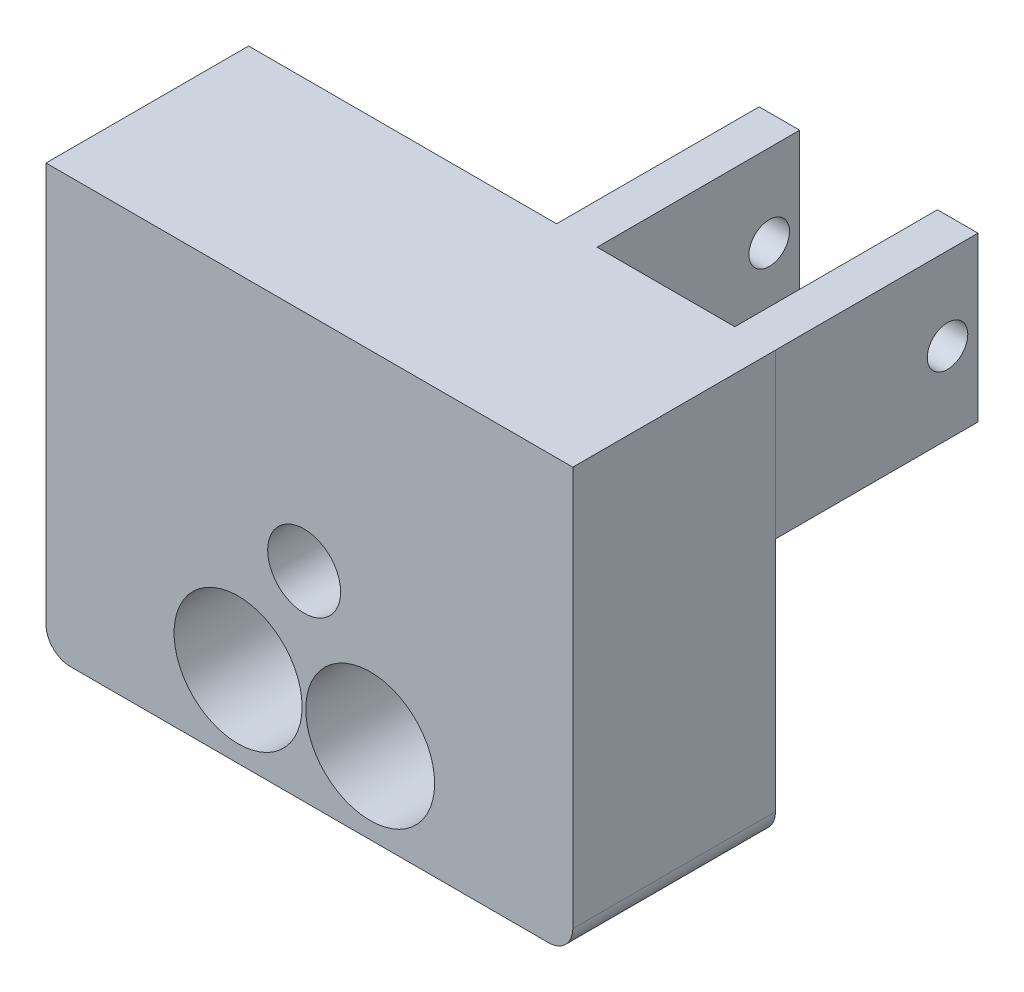
ISO-10303-21;
HEADER;
FILE_DESCRIPTION(('STEP AP214'),'2;1');
FILE_NAME('part.step','',(''),(''),'','','');
FILE_SCHEMA(('AUTOMOTIVE_DESIGN { 1 0 10303 214 1 1 1 1 }'));
ENDSEC;
DATA;
#1=APPLICATION_CONTEXT('core data for automotive mechanical design processes');
#2=APPLICATION_PROTOCOL_DEFINITION('international standard','automotive_design',2000,#1);
#3=PRODUCT_CONTEXT('',#1,'mechanical');
#4=PRODUCT('Part','Part','',(#3));
#5=PRODUCT_RELATED_PRODUCT_CATEGORY('part','',(#4));
#6=PRODUCT_DEFINITION_FORMATION('','',#4);
#7=PRODUCT_DEFINITION_CONTEXT('part definition',#1,'design');
#8=PRODUCT_DEFINITION('design','',#6,#7);
#9=PRODUCT_DEFINITION_SHAPE('','',#8);
#10=(LENGTH_UNIT() NAMED_UNIT(*) SI_UNIT(.MILLI.,.METRE.));
#11=(NAMED_UNIT(*) PLANE_ANGLE_UNIT() SI_UNIT($,.RADIAN.));
#12=(NAMED_UNIT(*) SI_UNIT($,.STERADIAN.) SOLID_ANGLE_UNIT());
#13=UNCERTAINTY_MEASURE_WITH_UNIT(LENGTH_MEASURE(1.E-05),#10,'distance_accuracy_value','');
#14=(GEOMETRIC_REPRESENTATION_CONTEXT(3) GLOBAL_UNCERTAINTY_ASSIGNED_CONTEXT((#13)) GLOBAL_UNIT_ASSIGNED_CONTEXT((#10,
#11,#12)) REPRESENTATION_CONTEXT('',''));
#15=CARTESIAN_POINT('',(0.,0.,0.));
#16=DIRECTION('',(0.,0.,1.));
#17=DIRECTION('',(1.,0.,0.));
#18=AXIS2_PLACEMENT_3D('',#15,#16,#17);
#19=CARTESIAN_POINT('',(71.85,24.6335231574628,25.));
#20=DIRECTION('',(0.,0.,-1.));
#21=DIRECTION('',(-1.,0.,0.));
#22=AXIS2_PLACEMENT_3D('',#19,#20,#21);
#23=CYLINDRICAL_SURFACE('',#22,4.5);
#24=CARTESIAN_POINT('',(71.85,24.6335231574628,25.));
#25=DIRECTION('',(0.,0.,1.));
#26=DIRECTION('',(1.,0.,0.));
#27=AXIS2_PLACEMENT_3D('',#24,#25,#26);
#28=CIRCLE('',#27,4.5);
#29=CARTESIAN_POINT('',(76.35,24.6335231574628,25.));
#30=VERTEX_POINT('',#29);
#31=EDGE_CURVE('E329',#30,#30,#28,.T.);
#32=ORIENTED_EDGE('',*,*,#31,.T.);
#33=EDGE_LOOP('',(#32));
#34=FACE_BOUND('',#33,.T.);
#35=CARTESIAN_POINT('',(71.85,24.6335231574628,7.5));
#36=DIRECTION('',(0.,0.,-1.));
#37=DIRECTION('',(-1.,0.,0.));
#38=AXIS2_PLACEMENT_3D('',#35,#36,#37);
#39=CIRCLE('',#38,4.5);
#40=CARTESIAN_POINT('',(67.35,24.6335231574628,7.5));
#41=VERTEX_POINT('',#40);
#42=EDGE_CURVE('E228',#41,#41,#39,.T.);
#43=ORIENTED_EDGE('',*,*,#42,.T.);
#44=EDGE_LOOP('',(#43));
#45=FACE_BOUND('',#44,.T.);
#46=ADVANCED_FACE('F35',(#34,#45),#23,.F.);
#47=CARTESIAN_POINT('',(0.,0.,25.));
#48=DIRECTION('',(0.,0.,-1.));
#49=DIRECTION('',(-1.,0.,0.));
#50=AXIS2_PLACEMENT_3D('',#47,#48,#49);
#51=PLANE('',#50);
#52=CARTESIAN_POINT('',(80.,10.,25.));
#53=DIRECTION('',(0.,0.,1.));
#54=DIRECTION('',(1.,0.,0.));
#55=AXIS2_PLACEMENT_3D('',#52,#53,#54);
#56=CIRCLE('',#55,7.95);
#57=CARTESIAN_POINT('',(87.95,10.,25.));
#58=VERTEX_POINT('',#57);
#59=EDGE_CURVE('E332',#58,#58,#56,.T.);
#60=ORIENTED_EDGE('',*,*,#59,.F.);
#61=EDGE_LOOP('',(#60));
#62=FACE_BOUND('',#61,.T.);
#63=ORIENTED_EDGE('',*,*,#31,.F.);
#64=EDGE_LOOP('',(#63));
#65=FACE_BOUND('',#64,.T.);
#66=CARTESIAN_POINT('',(63.7,10.,25.));
#67=DIRECTION('',(0.,0.,1.));
#68=DIRECTION('',(1.,0.,0.));
#69=AXIS2_PLACEMENT_3D('',#66,#67,#68);
#70=CIRCLE('',#69,7.9);
#71=CARTESIAN_POINT('',(71.6,10.,25.));
#72=VERTEX_POINT('',#71);
#73=EDGE_CURVE('E205',#72,#72,#70,.T.);
#74=ORIENTED_EDGE('',*,*,#73,.F.);
#75=EDGE_LOOP('',(#74));
#76=FACE_BOUND('',#75,.T.);
#77=DIRECTION('',(0.,1.,0.));
#78=VECTOR('',#77,1.);
#79=CARTESIAN_POINT('',(105.,0.,25.));
#80=LINE('',#79,#78);
#81=CARTESIAN_POINT('',(105.,3.,25.));
#82=VERTEX_POINT('',#81);
#83=CARTESIAN_POINT('',(105.,52.3118668700041,25.));
#84=VERTEX_POINT('',#83);
#85=EDGE_CURVE('E202',#82,#84,#80,.T.);
#86=ORIENTED_EDGE('',*,*,#85,.T.);
#87=DIRECTION('',(-1.,0.,0.));
#88=VECTOR('',#87,1.);
#89=CARTESIAN_POINT('',(105.676011247242,52.3118668700041,25.));
#90=LINE('',#89,#88);
#91=CARTESIAN_POINT('',(40.,52.3118668700041,25.));
#92=VERTEX_POINT('',#91);
#93=EDGE_CURVE('E178',#84,#92,#90,.T.);
#94=ORIENTED_EDGE('',*,*,#93,.T.);
#95=DIRECTION('',(0.,1.,0.));
#96=VECTOR('',#95,1.);
#97=CARTESIAN_POINT('',(40.,0.,25.));
#98=LINE('',#97,#96);
#99=CARTESIAN_POINT('',(40.,3.,25.));
#100=VERTEX_POINT('',#99);
#101=EDGE_CURVE('E314',#100,#92,#98,.T.);
#102=ORIENTED_EDGE('',*,*,#101,.F.);
#103=CARTESIAN_POINT('',(43.,3.,25.));
#104=DIRECTION('',(0.,0.,-1.));
#105=DIRECTION('',(-1.,0.,0.));
#106=AXIS2_PLACEMENT_3D('',#103,#104,#105);
#107=CIRCLE('',#106,3.);
#108=CARTESIAN_POINT('',(43.,0.,25.));
#109=VERTEX_POINT('',#108);
#110=EDGE_CURVE('E216',#100,#109,#107,.F.);
#111=ORIENTED_EDGE('',*,*,#110,.T.);
#112=DIRECTION('',(1.,0.,0.));
#113=VECTOR('',#112,1.);
#114=CARTESIAN_POINT('',(0.,0.,25.));
#115=LINE('',#114,#113);
#116=CARTESIAN_POINT('',(102.,0.,25.));
#117=VERTEX_POINT('',#116);
#118=EDGE_CURVE('E198',#109,#117,#115,.T.);
#119=ORIENTED_EDGE('',*,*,#118,.T.);
#120=CARTESIAN_POINT('',(102.,3.,25.));
#121=DIRECTION('',(0.,0.,-1.));
#122=DIRECTION('',(-1.,0.,0.));
#123=AXIS2_PLACEMENT_3D('',#120,#121,#122);
#124=CIRCLE('',#123,3.);
#125=EDGE_CURVE('E214',#117,#82,#124,.F.);
#126=ORIENTED_EDGE('',*,*,#125,.T.);
#127=EDGE_LOOP('',(#86,#94,#102,#111,#119,#126));
#128=FACE_BOUND('',#127,.T.);
#129=ADVANCED_FACE('F345',(#62,#65,#76,#128),#51,.F.);
#130=CARTESIAN_POINT('',(0.,0.,0.));
#131=DIRECTION('',(0.,0.,-1.));
#132=DIRECTION('',(-1.,0.,0.));
#133=AXIS2_PLACEMENT_3D('',#130,#131,#132);
#134=PLANE('',#133);
#135=DIRECTION('',(-1.,0.,0.));
#136=VECTOR('',#135,1.);
#137=CARTESIAN_POINT('',(104.991701760348,52.3118668700041,0.));
#138=LINE('',#137,#136);
#139=CARTESIAN_POINT('',(105.,52.3118668700041,0.));
#140=VERTEX_POINT('',#139);
#141=CARTESIAN_POINT('',(104.991701760348,52.3118668700041,0.));
#142=VERTEX_POINT('',#141);
#143=EDGE_CURVE('E175',#140,#142,#138,.T.);
#144=ORIENTED_EDGE('',*,*,#143,.F.);
#145=DIRECTION('',(0.,1.,0.));
#146=VECTOR('',#145,1.);
#147=CARTESIAN_POINT('',(105.,0.,0.));
#148=LINE('',#147,#146);
#149=CARTESIAN_POINT('',(105.,3.,0.));
#150=VERTEX_POINT('',#149);
#151=EDGE_CURVE('E187',#150,#140,#148,.T.);
#152=ORIENTED_EDGE('',*,*,#151,.F.);
#153=CARTESIAN_POINT('',(102.,3.,0.));
#154=DIRECTION('',(0.,0.,-1.));
#155=DIRECTION('',(-1.,0.,0.));
#156=AXIS2_PLACEMENT_3D('',#153,#154,#155);
#157=CIRCLE('',#156,3.);
#158=CARTESIAN_POINT('',(102.,0.,0.));
#159=VERTEX_POINT('',#158);
#160=EDGE_CURVE('E209',#150,#159,#157,.T.);
#161=ORIENTED_EDGE('',*,*,#160,.T.);
#162=DIRECTION('',(1.,0.,0.));
#163=VECTOR('',#162,1.);
#164=CARTESIAN_POINT('',(0.,0.,0.));
#165=LINE('',#164,#163);
#166=CARTESIAN_POINT('',(43.,0.,0.));
#167=VERTEX_POINT('',#166);
#168=EDGE_CURVE('E199',#167,#159,#165,.T.);
#169=ORIENTED_EDGE('',*,*,#168,.F.);
#170=CARTESIAN_POINT('',(43.,3.,0.));
#171=DIRECTION('',(0.,0.,-1.));
#172=DIRECTION('',(-1.,0.,0.));
#173=AXIS2_PLACEMENT_3D('',#170,#171,#172);
#174=CIRCLE('',#173,3.);
#175=CARTESIAN_POINT('',(40.,3.,0.));
#176=VERTEX_POINT('',#175);
#177=EDGE_CURVE('E211',#167,#176,#174,.T.);
#178=ORIENTED_EDGE('',*,*,#177,.T.);
#179=DIRECTION('',(0.,1.,0.));
#180=VECTOR('',#179,1.);
#181=CARTESIAN_POINT('',(40.,0.,0.));
#182=LINE('',#181,#180);
#183=CARTESIAN_POINT('',(40.,52.3118668700041,0.));
#184=VERTEX_POINT('',#183);
#185=EDGE_CURVE('E307',#176,#184,#182,.T.);
#186=ORIENTED_EDGE('',*,*,#185,.T.);
#187=CARTESIAN_POINT('',(77.9917017603477,52.3118668700041,0.));
#188=VERTEX_POINT('',#187);
#189=EDGE_CURVE('E193',#188,#184,#138,.T.);
#190=ORIENTED_EDGE('',*,*,#189,.F.);
#191=DIRECTION('',(0.,-1.,0.));
#192=VECTOR('',#191,1.);
#193=CARTESIAN_POINT('',(77.9917017603477,52.3118668700041,0.));
#194=LINE('',#193,#192);
#195=CARTESIAN_POINT('',(77.9917017603477,32.1318668700041,0.));
#196=VERTEX_POINT('',#195);
#197=EDGE_CURVE('E273',#188,#196,#194,.T.);
#198=ORIENTED_EDGE('',*,*,#197,.T.);
#199=DIRECTION('',(1.,0.,0.));
#200=VECTOR('',#199,1.);
#201=CARTESIAN_POINT('',(82.9917017603477,32.1318668700041,0.));
#202=LINE('',#201,#200);
#203=CARTESIAN_POINT('',(82.9917017603477,32.1318668700041,0.));
#204=VERTEX_POINT('',#203);
#205=EDGE_CURVE('E58',#196,#204,#202,.T.);
#206=ORIENTED_EDGE('',*,*,#205,.T.);
#207=DIRECTION('',(0.,1.,0.));
#208=VECTOR('',#207,1.);
#209=CARTESIAN_POINT('',(82.9917017603477,52.3118668700041,0.));
#210=LINE('',#209,#208);
#211=CARTESIAN_POINT('',(82.9917017603477,52.3118668700041,0.));
#212=VERTEX_POINT('',#211);
#213=EDGE_CURVE('E258',#204,#212,#210,.T.);
#214=ORIENTED_EDGE('',*,*,#213,.T.);
#215=CARTESIAN_POINT('',(99.9917017603477,52.3118668700041,0.));
#216=VERTEX_POINT('',#215);
#217=EDGE_CURVE('E191',#216,#212,#138,.T.);
#218=ORIENTED_EDGE('',*,*,#217,.F.);
#219=DIRECTION('',(0.,-1.,0.));
#220=VECTOR('',#219,1.);
#221=CARTESIAN_POINT('',(99.9917017603477,32.1324370135775,0.));
#222=LINE('',#221,#220);
#223=CARTESIAN_POINT('',(99.9917017603477,32.1324370135775,0.));
#224=VERTEX_POINT('',#223);
#225=EDGE_CURVE('E301',#216,#224,#222,.T.);
#226=ORIENTED_EDGE('',*,*,#225,.T.);
#227=DIRECTION('',(1.,0.,0.));
#228=VECTOR('',#227,1.);
#229=CARTESIAN_POINT('',(104.991701760348,32.1324370135775,0.));
#230=LINE('',#229,#228);
#231=CARTESIAN_POINT('',(104.991701760348,32.1324370135775,0.));
#232=VERTEX_POINT('',#231);
#233=EDGE_CURVE('E290',#224,#232,#230,.T.);
#234=ORIENTED_EDGE('',*,*,#233,.T.);
#235=DIRECTION('',(0.,1.,0.));
#236=VECTOR('',#235,1.);
#237=CARTESIAN_POINT('',(104.991701760348,32.1324370135775,0.));
#238=LINE('',#237,#236);
#239=EDGE_CURVE('E189',#232,#142,#238,.T.);
#240=ORIENTED_EDGE('',*,*,#239,.T.);
#241=EDGE_LOOP('',(#144,#152,#161,#169,#178,#186,#190,#198,#206,#214,#218,#226,#234,#240));
#242=FACE_BOUND('',#241,.T.);
#243=DIRECTION('',(0.948357369873563,0.317203876089966,0.));
#244=VECTOR('',#243,1.);
#245=CARTESIAN_POINT('',(66.099490578485,29.7222336745192,0.));
#246=LINE('',#245,#244);
#247=CARTESIAN_POINT('',(66.099490578485,29.7222336745192,0.));
#248=VERTEX_POINT('',#247);
#249=CARTESIAN_POINT('',(73.3816978695184,32.1579656597248,0.));
#250=VERTEX_POINT('',#249);
#251=EDGE_CURVE('E50',#248,#250,#246,.T.);
#252=ORIENTED_EDGE('',*,*,#251,.F.);
#253=DIRECTION('',(0.199472070063981,0.979903512221683,0.));
#254=VECTOR('',#253,1.);
#255=CARTESIAN_POINT('',(64.5677927089666,22.1977911722573,0.));
#256=LINE('',#255,#254);
#257=CARTESIAN_POINT('',(64.5677927089666,22.1977911722573,0.));
#258=VERTEX_POINT('',#257);
#259=EDGE_CURVE('E242',#258,#248,#256,.T.);
#260=ORIENTED_EDGE('',*,*,#259,.F.);
#261=DIRECTION('',(-0.748885299809583,0.662699636131718,0.));
#262=VECTOR('',#261,1.);
#263=CARTESIAN_POINT('',(70.3183021304815,17.1090806552008,0.));
#264=LINE('',#263,#262);
#265=CARTESIAN_POINT('',(70.3183021304815,17.1090806552008,0.));
#266=VERTEX_POINT('',#265);
#267=EDGE_CURVE('E397',#266,#258,#264,.T.);
#268=ORIENTED_EDGE('',*,*,#267,.F.);
#269=DIRECTION('',(-0.948357369873563,-0.317203876089965,0.));
#270=VECTOR('',#269,1.);
#271=CARTESIAN_POINT('',(77.600509421515,19.5448126404064,0.));
#272=LINE('',#271,#270);
#273=CARTESIAN_POINT('',(77.600509421515,19.5448126404064,0.));
#274=VERTEX_POINT('',#273);
#275=EDGE_CURVE('E395',#274,#266,#272,.T.);
#276=ORIENTED_EDGE('',*,*,#275,.F.);
#277=DIRECTION('',(-0.199472070063981,-0.979903512221683,0.));
#278=VECTOR('',#277,1.);
#279=CARTESIAN_POINT('',(79.1322072910334,27.0692551426683,0.));
#280=LINE('',#279,#278);
#281=CARTESIAN_POINT('',(79.1322072910334,27.0692551426683,0.));
#282=VERTEX_POINT('',#281);
#283=EDGE_CURVE('E392',#282,#274,#280,.T.);
#284=ORIENTED_EDGE('',*,*,#283,.F.);
#285=DIRECTION('',(0.748885299809583,-0.662699636131717,0.));
#286=VECTOR('',#285,1.);
#287=CARTESIAN_POINT('',(73.3816978695184,32.1579656597248,0.));
#288=LINE('',#287,#286);
#289=EDGE_CURVE('E389',#250,#282,#288,.T.);
#290=ORIENTED_EDGE('',*,*,#289,.F.);
#291=EDGE_LOOP('',(#252,#260,#268,#276,#284,#290));
#292=FACE_BOUND('',#291,.T.);
#293=CARTESIAN_POINT('',(80.,10.,0.));
#294=DIRECTION('',(0.,0.,1.));
#295=DIRECTION('',(1.,0.,0.));
#296=AXIS2_PLACEMENT_3D('',#293,#294,#295);
#297=CIRCLE('',#296,7.95);
#298=CARTESIAN_POINT('',(87.95,10.,0.));
#299=VERTEX_POINT('',#298);
#300=EDGE_CURVE('E336',#299,#299,#297,.T.);
#301=ORIENTED_EDGE('',*,*,#300,.T.);
#302=EDGE_LOOP('',(#301));
#303=FACE_BOUND('',#302,.T.);
#304=CARTESIAN_POINT('',(63.7,10.,0.));
#305=DIRECTION('',(0.,0.,1.));
#306=DIRECTION('',(1.,0.,0.));
#307=AXIS2_PLACEMENT_3D('',#304,#305,#306);
#308=CIRCLE('',#307,7.9);
#309=CARTESIAN_POINT('',(71.6,10.,0.));
#310=VERTEX_POINT('',#309);
#311=EDGE_CURVE('E335',#310,#310,#308,.T.);
#312=ORIENTED_EDGE('',*,*,#311,.T.);
#313=EDGE_LOOP('',(#312));
#314=FACE_BOUND('',#313,.T.);
#315=ADVANCED_FACE('F185',(#242,#292,#303,#314),#134,.T.);
#316=CARTESIAN_POINT('',(105.,0.,25.));
#317=DIRECTION('',(-1.,0.,0.));
#318=DIRECTION('',(0.,0.,1.));
#319=AXIS2_PLACEMENT_3D('',#316,#317,#318);
#320=PLANE('',#319);
#321=ORIENTED_EDGE('',*,*,#151,.T.);
#322=DIRECTION('',(0.,0.,1.));
#323=VECTOR('',#322,1.);
#324=CARTESIAN_POINT('',(105.,52.3118668700041,25.));
#325=LINE('',#324,#323);
#326=EDGE_CURVE('E171',#140,#84,#325,.T.);
#327=ORIENTED_EDGE('',*,*,#326,.T.);
#328=ORIENTED_EDGE('',*,*,#85,.F.);
#329=DIRECTION('',(0.,0.,-1.));
#330=VECTOR('',#329,1.);
#331=CARTESIAN_POINT('',(105.,3.,25.));
#332=LINE('',#331,#330);
#333=EDGE_CURVE('E197',#82,#150,#332,.T.);
#334=ORIENTED_EDGE('',*,*,#333,.T.);
#335=EDGE_LOOP('',(#321,#327,#328,#334));
#336=FACE_BOUND('',#335,.T.);
#337=ADVANCED_FACE('F195',(#336),#320,.F.);
#338=CARTESIAN_POINT('',(40.,0.,25.));
#339=DIRECTION('',(-1.,0.,0.));
#340=DIRECTION('',(0.,0.,1.));
#341=AXIS2_PLACEMENT_3D('',#338,#339,#340);
#342=PLANE('',#341);
#343=CARTESIAN_POINT('',(40.,25.9999999999999,15.));
#344=DIRECTION('',(-1.,0.,0.));
#345=DIRECTION('',(0.,0.,1.));
#346=AXIS2_PLACEMENT_3D('',#343,#344,#345);
#347=CIRCLE('',#346,1.5);
#348=CARTESIAN_POINT('',(40.,25.9999999999999,16.5));
#349=VERTEX_POINT('',#348);
#350=EDGE_CURVE('E766',#349,#349,#347,.T.);
#351=ORIENTED_EDGE('',*,*,#350,.F.);
#352=EDGE_LOOP('',(#351));
#353=FACE_BOUND('',#352,.T.);
#354=CARTESIAN_POINT('',(40.,14.751876189925,15.));
#355=DIRECTION('',(-1.,0.,0.));
#356=DIRECTION('',(0.,0.,1.));
#357=AXIS2_PLACEMENT_3D('',#354,#355,#356);
#358=CIRCLE('',#357,1.5);
#359=CARTESIAN_POINT('',(40.,14.751876189925,16.5));
#360=VERTEX_POINT('',#359);
#361=EDGE_CURVE('E366',#360,#360,#358,.T.);
#362=ORIENTED_EDGE('',*,*,#361,.F.);
#363=EDGE_LOOP('',(#362));
#364=FACE_BOUND('',#363,.T.);
#365=DIRECTION('',(0.,0.,1.));
#366=VECTOR('',#365,1.);
#367=CARTESIAN_POINT('',(40.,52.3118668700041,25.));
#368=LINE('',#367,#366);
#369=EDGE_CURVE('E11',#184,#92,#368,.T.);
#370=ORIENTED_EDGE('',*,*,#369,.F.);
#371=ORIENTED_EDGE('',*,*,#185,.F.);
#372=DIRECTION('',(0.,0.,-1.));
#373=VECTOR('',#372,1.);
#374=CARTESIAN_POINT('',(40.,3.,25.));
#375=LINE('',#374,#373);
#376=EDGE_CURVE('E218',#176,#100,#375,.F.);
#377=ORIENTED_EDGE('',*,*,#376,.T.);
#378=ORIENTED_EDGE('',*,*,#101,.T.);
#379=EDGE_LOOP('',(#370,#371,#377,#378));
#380=FACE_BOUND('',#379,.T.);
#381=ADVANCED_FACE('F362',(#353,#364,#380),#342,.T.);
#382=CARTESIAN_POINT('',(0.,0.,25.));
#383=DIRECTION('',(0.,1.,0.));
#384=DIRECTION('',(0.,0.,1.));
#385=AXIS2_PLACEMENT_3D('',#382,#383,#384);
#386=PLANE('',#385);
#387=CARTESIAN_POINT('',(49.,0.,12.5));
#388=DIRECTION('',(0.,1.,0.));
#389=DIRECTION('',(0.,0.,1.));
#390=AXIS2_PLACEMENT_3D('',#387,#388,#389);
#391=CIRCLE('',#390,4.00000000000001);
#392=CARTESIAN_POINT('',(49.,0.,16.5));
#393=VERTEX_POINT('',#392);
#394=EDGE_CURVE('E323',#393,#393,#391,.T.);
#395=ORIENTED_EDGE('',*,*,#394,.T.);
#396=EDGE_LOOP('',(#395));
#397=FACE_BOUND('',#396,.T.);
#398=CARTESIAN_POINT('',(93.,0.,12.5));
#399=DIRECTION('',(0.,1.,0.));
#400=DIRECTION('',(0.,0.,1.));
#401=AXIS2_PLACEMENT_3D('',#398,#399,#400);
#402=CIRCLE('',#401,4.00000000000001);
#403=CARTESIAN_POINT('',(93.,0.,16.5));
#404=VERTEX_POINT('',#403);
#405=EDGE_CURVE('E317',#404,#404,#402,.T.);
#406=ORIENTED_EDGE('',*,*,#405,.T.);
#407=EDGE_LOOP('',(#406));
#408=FACE_BOUND('',#407,.T.);
#409=ORIENTED_EDGE('',*,*,#118,.F.);
#410=DIRECTION('',(0.,0.,-1.));
#411=VECTOR('',#410,1.);
#412=CARTESIAN_POINT('',(43.,0.,0.));
#413=LINE('',#412,#411);
#414=EDGE_CURVE('E43',#109,#167,#413,.T.);
#415=ORIENTED_EDGE('',*,*,#414,.T.);
#416=ORIENTED_EDGE('',*,*,#168,.T.);
#417=DIRECTION('',(0.,0.,-1.));
#418=VECTOR('',#417,1.);
#419=CARTESIAN_POINT('',(102.,0.,25.));
#420=LINE('',#419,#418);
#421=EDGE_CURVE('E220',#159,#117,#420,.F.);
#422=ORIENTED_EDGE('',*,*,#421,.T.);
#423=EDGE_LOOP('',(#409,#415,#416,#422));
#424=FACE_BOUND('',#423,.T.);
#425=ADVANCED_FACE('F353',(#397,#408,#424),#386,.F.);
#426=CARTESIAN_POINT('',(63.7,10.,25.));
#427=DIRECTION('',(0.,0.,-1.));
#428=DIRECTION('',(-1.,0.,0.));
#429=AXIS2_PLACEMENT_3D('',#426,#427,#428);
#430=CYLINDRICAL_SURFACE('',#429,7.9);
#431=ORIENTED_EDGE('',*,*,#73,.T.);
#432=EDGE_LOOP('',(#431));
#433=FACE_BOUND('',#432,.T.);
#434=ORIENTED_EDGE('',*,*,#311,.F.);
#435=EDGE_LOOP('',(#434));
#436=FACE_BOUND('',#435,.T.);
#437=ADVANCED_FACE('F443',(#433,#436),#430,.F.);
#438=CARTESIAN_POINT('',(80.,10.,25.));
#439=DIRECTION('',(0.,0.,-1.));
#440=DIRECTION('',(-1.,0.,0.));
#441=AXIS2_PLACEMENT_3D('',#438,#439,#440);
#442=CYLINDRICAL_SURFACE('',#441,7.95);
#443=ORIENTED_EDGE('',*,*,#59,.T.);
#444=EDGE_LOOP('',(#443));
#445=FACE_BOUND('',#444,.T.);
#446=ORIENTED_EDGE('',*,*,#300,.F.);
#447=EDGE_LOOP('',(#446));
#448=FACE_BOUND('',#447,.T.);
#449=ADVANCED_FACE('F441',(#445,#448),#442,.F.);
#450=CARTESIAN_POINT('',(49.,10.,12.5));
#451=DIRECTION('',(0.,-1.,0.));
#452=DIRECTION('',(0.,0.,-1.));
#453=AXIS2_PLACEMENT_3D('',#450,#451,#452);
#454=CYLINDRICAL_SURFACE('',#453,4.00000000000001);
#455=CARTESIAN_POINT('',(49.,10.,12.5));
#456=DIRECTION('',(0.,1.,0.));
#457=DIRECTION('',(0.,0.,1.));
#458=AXIS2_PLACEMENT_3D('',#455,#456,#457);
#459=CIRCLE('',#458,4.00000000000001);
#460=CARTESIAN_POINT('',(49.,10.,16.5));
#461=VERTEX_POINT('',#460);
#462=EDGE_CURVE('E326',#461,#461,#459,.T.);
#463=ORIENTED_EDGE('',*,*,#462,.T.);
#464=EDGE_LOOP('',(#463));
#465=FACE_BOUND('',#464,.T.);
#466=ORIENTED_EDGE('',*,*,#394,.F.);
#467=EDGE_LOOP('',(#466));
#468=FACE_BOUND('',#467,.T.);
#469=ADVANCED_FACE('F474',(#465,#468),#454,.F.);
#470=CARTESIAN_POINT('',(49.,10.,12.5));
#471=DIRECTION('',(0.,1.,0.));
#472=DIRECTION('',(0.,0.,1.));
#473=AXIS2_PLACEMENT_3D('',#470,#471,#472);
#474=PLANE('',#473);
#475=ORIENTED_EDGE('',*,*,#462,.F.);
#476=EDGE_LOOP('',(#475));
#477=FACE_BOUND('',#476,.T.);
#478=ADVANCED_FACE('F466',(#477),#474,.F.);
#479=CARTESIAN_POINT('',(93.,10.,12.5));
#480=DIRECTION('',(0.,-1.,0.));
#481=DIRECTION('',(0.,0.,-1.));
#482=AXIS2_PLACEMENT_3D('',#479,#480,#481);
#483=CYLINDRICAL_SURFACE('',#482,4.00000000000001);
#484=CARTESIAN_POINT('',(93.,10.,12.5));
#485=DIRECTION('',(0.,1.,0.));
#486=DIRECTION('',(0.,0.,1.));
#487=AXIS2_PLACEMENT_3D('',#484,#485,#486);
#488=CIRCLE('',#487,4.00000000000001);
#489=CARTESIAN_POINT('',(93.,10.,16.5));
#490=VERTEX_POINT('',#489);
#491=EDGE_CURVE('E320',#490,#490,#488,.T.);
#492=ORIENTED_EDGE('',*,*,#491,.T.);
#493=EDGE_LOOP('',(#492));
#494=FACE_BOUND('',#493,.T.);
#495=ORIENTED_EDGE('',*,*,#405,.F.);
#496=EDGE_LOOP('',(#495));
#497=FACE_BOUND('',#496,.T.);
#498=ADVANCED_FACE('F460',(#494,#497),#483,.F.);
#499=CARTESIAN_POINT('',(93.,10.,12.5));
#500=DIRECTION('',(0.,1.,0.));
#501=DIRECTION('',(0.,0.,1.));
#502=AXIS2_PLACEMENT_3D('',#499,#500,#501);
#503=PLANE('',#502);
#504=ORIENTED_EDGE('',*,*,#491,.F.);
#505=EDGE_LOOP('',(#504));
#506=FACE_BOUND('',#505,.T.);
#507=ADVANCED_FACE('F454',(#506),#503,.F.);
#508=CARTESIAN_POINT('',(43.,3.,25.));
#509=DIRECTION('',(0.,0.,1.));
#510=DIRECTION('',(1.,0.,0.));
#511=AXIS2_PLACEMENT_3D('',#508,#509,#510);
#512=CYLINDRICAL_SURFACE('',#511,3.);
#513=ORIENTED_EDGE('',*,*,#110,.F.);
#514=ORIENTED_EDGE('',*,*,#376,.F.);
#515=ORIENTED_EDGE('',*,*,#177,.F.);
#516=ORIENTED_EDGE('',*,*,#414,.F.);
#517=EDGE_LOOP('',(#513,#514,#515,#516));
#518=FACE_BOUND('',#517,.T.);
#519=ADVANCED_FACE('F357',(#518),#512,.T.);
#520=CARTESIAN_POINT('',(102.,3.,25.));
#521=DIRECTION('',(0.,0.,-1.));
#522=DIRECTION('',(-1.,0.,0.));
#523=AXIS2_PLACEMENT_3D('',#520,#521,#522);
#524=CYLINDRICAL_SURFACE('',#523,3.);
#525=ORIENTED_EDGE('',*,*,#125,.F.);
#526=ORIENTED_EDGE('',*,*,#421,.F.);
#527=ORIENTED_EDGE('',*,*,#160,.F.);
#528=ORIENTED_EDGE('',*,*,#333,.F.);
#529=EDGE_LOOP('',(#525,#526,#527,#528));
#530=FACE_BOUND('',#529,.T.);
#531=ADVANCED_FACE('F37',(#530),#524,.T.);
#532=CARTESIAN_POINT('',(104.991701760348,32.1324370135775,-25.));
#533=DIRECTION('',(1.,0.,0.));
#534=DIRECTION('',(0.,1.,0.));
#535=AXIS2_PLACEMENT_3D('',#532,#533,#534);
#536=PLANE('',#535);
#537=CARTESIAN_POINT('',(104.991701760348,42.1324370135775,-21.24));
#538=DIRECTION('',(1.,0.,0.));
#539=DIRECTION('',(0.,0.,-1.));
#540=AXIS2_PLACEMENT_3D('',#537,#538,#539);
#541=CIRCLE('',#540,2.5);
#542=CARTESIAN_POINT('',(104.991701760348,42.1324370135775,-23.74));
#543=VERTEX_POINT('',#542);
#544=EDGE_CURVE('E227',#543,#543,#541,.T.);
#545=ORIENTED_EDGE('',*,*,#544,.F.);
#546=EDGE_LOOP('',(#545));
#547=FACE_BOUND('',#546,.T.);
#548=ORIENTED_EDGE('',*,*,#239,.F.);
#549=DIRECTION('',(0.,0.,1.));
#550=VECTOR('',#549,1.);
#551=CARTESIAN_POINT('',(104.991701760348,32.1324370135775,-25.));
#552=LINE('',#551,#550);
#553=CARTESIAN_POINT('',(104.991701760348,32.1324370135775,-25.));
#554=VERTEX_POINT('',#553);
#555=EDGE_CURVE('E304',#554,#232,#552,.T.);
#556=ORIENTED_EDGE('',*,*,#555,.F.);
#557=DIRECTION('',(0.,1.,0.));
#558=VECTOR('',#557,1.);
#559=CARTESIAN_POINT('',(104.991701760348,32.1324370135775,-25.));
#560=LINE('',#559,#558);
#561=CARTESIAN_POINT('',(104.991701760348,52.3118668700041,-25.));
#562=VERTEX_POINT('',#561);
#563=EDGE_CURVE('E286',#554,#562,#560,.T.);
#564=ORIENTED_EDGE('',*,*,#563,.T.);
#565=DIRECTION('',(0.,0.,1.));
#566=VECTOR('',#565,1.);
#567=CARTESIAN_POINT('',(104.991701760348,52.3118668700041,-25.));
#568=LINE('',#567,#566);
#569=EDGE_CURVE('E299',#562,#142,#568,.T.);
#570=ORIENTED_EDGE('',*,*,#569,.T.);
#571=EDGE_LOOP('',(#548,#556,#564,#570));
#572=FACE_BOUND('',#571,.T.);
#573=ADVANCED_FACE('F459',(#547,#572),#536,.T.);
#574=CARTESIAN_POINT('',(104.991701760348,32.1324370135775,-25.));
#575=DIRECTION('',(0.,-1.,0.));
#576=DIRECTION('',(0.,0.,-1.));
#577=AXIS2_PLACEMENT_3D('',#574,#575,#576);
#578=PLANE('',#577);
#579=ORIENTED_EDGE('',*,*,#233,.F.);
#580=DIRECTION('',(0.,0.,1.));
#581=VECTOR('',#580,1.);
#582=CARTESIAN_POINT('',(99.9917017603477,32.1324370135775,-25.));
#583=LINE('',#582,#581);
#584=CARTESIAN_POINT('',(99.9917017603477,32.1324370135775,-25.));
#585=VERTEX_POINT('',#584);
#586=EDGE_CURVE('E308',#585,#224,#583,.T.);
#587=ORIENTED_EDGE('',*,*,#586,.F.);
#588=DIRECTION('',(1.,0.,0.));
#589=VECTOR('',#588,1.);
#590=CARTESIAN_POINT('',(104.991701760348,32.1324370135775,-25.));
#591=LINE('',#590,#589);
#592=EDGE_CURVE('E296',#585,#554,#591,.T.);
#593=ORIENTED_EDGE('',*,*,#592,.T.);
#594=ORIENTED_EDGE('',*,*,#555,.T.);
#595=EDGE_LOOP('',(#579,#587,#593,#594));
#596=FACE_BOUND('',#595,.T.);
#597=ADVANCED_FACE('F650',(#596),#578,.T.);
#598=CARTESIAN_POINT('',(99.9917017603477,32.1324370135775,-25.));
#599=DIRECTION('',(-1.,0.,0.));
#600=DIRECTION('',(0.,-1.,0.));
#601=AXIS2_PLACEMENT_3D('',#598,#599,#600);
#602=PLANE('',#601);
#603=CARTESIAN_POINT('',(99.9917017603477,42.1324370135775,-21.24));
#604=DIRECTION('',(-1.,0.,0.));
#605=DIRECTION('',(0.,-1.,0.));
#606=AXIS2_PLACEMENT_3D('',#603,#604,#605);
#607=CIRCLE('',#606,2.5);
#608=CARTESIAN_POINT('',(99.9917017603477,39.6324370135775,-21.24));
#609=VERTEX_POINT('',#608);
#610=EDGE_CURVE('E255',#609,#609,#607,.T.);
#611=ORIENTED_EDGE('',*,*,#610,.F.);
#612=EDGE_LOOP('',(#611));
#613=FACE_BOUND('',#612,.T.);
#614=ORIENTED_EDGE('',*,*,#225,.F.);
#615=DIRECTION('',(0.,0.,1.));
#616=VECTOR('',#615,1.);
#617=CARTESIAN_POINT('',(99.9917017603477,52.3118668700041,-25.));
#618=LINE('',#617,#616);
#619=CARTESIAN_POINT('',(99.9917017603477,52.3118668700041,-25.));
#620=VERTEX_POINT('',#619);
#621=EDGE_CURVE('E311',#620,#216,#618,.T.);
#622=ORIENTED_EDGE('',*,*,#621,.F.);
#623=DIRECTION('',(0.,-1.,0.));
#624=VECTOR('',#623,1.);
#625=CARTESIAN_POINT('',(99.9917017603477,32.1324370135775,-25.));
#626=LINE('',#625,#624);
#627=EDGE_CURVE('E293',#620,#585,#626,.T.);
#628=ORIENTED_EDGE('',*,*,#627,.T.);
#629=ORIENTED_EDGE('',*,*,#586,.T.);
#630=EDGE_LOOP('',(#614,#622,#628,#629));
#631=FACE_BOUND('',#630,.T.);
#632=ADVANCED_FACE('F655',(#613,#631),#602,.T.);
#633=CARTESIAN_POINT('',(104.991701760348,52.3118668700041,-25.));
#634=DIRECTION('',(0.,1.,0.));
#635=DIRECTION('',(0.,0.,1.));
#636=AXIS2_PLACEMENT_3D('',#633,#634,#635);
#637=PLANE('',#636);
#638=ORIENTED_EDGE('',*,*,#621,.T.);
#639=ORIENTED_EDGE('',*,*,#217,.T.);
#640=DIRECTION('',(0.,0.,1.));
#641=VECTOR('',#640,1.);
#642=CARTESIAN_POINT('',(82.9917017603477,52.3118668700041,-25.));
#643=LINE('',#642,#641);
#644=CARTESIAN_POINT('',(82.9917017603477,52.3118668700041,-25.));
#645=VERTEX_POINT('',#644);
#646=EDGE_CURVE('E271',#645,#212,#643,.T.);
#647=ORIENTED_EDGE('',*,*,#646,.F.);
#648=DIRECTION('',(-1.,0.,0.));
#649=VECTOR('',#648,1.);
#650=CARTESIAN_POINT('',(82.9917017603477,52.3118668700041,-25.));
#651=LINE('',#650,#649);
#652=CARTESIAN_POINT('',(77.9917017603477,52.3118668700041,-25.));
#653=VERTEX_POINT('',#652);
#654=EDGE_CURVE('E262',#645,#653,#651,.T.);
#655=ORIENTED_EDGE('',*,*,#654,.T.);
#656=DIRECTION('',(0.,0.,1.));
#657=VECTOR('',#656,1.);
#658=CARTESIAN_POINT('',(77.9917017603477,52.3118668700041,-25.));
#659=LINE('',#658,#657);
#660=EDGE_CURVE('E281',#653,#188,#659,.T.);
#661=ORIENTED_EDGE('',*,*,#660,.T.);
#662=ORIENTED_EDGE('',*,*,#189,.T.);
#663=ORIENTED_EDGE('',*,*,#369,.T.);
#664=ORIENTED_EDGE('',*,*,#93,.F.);
#665=ORIENTED_EDGE('',*,*,#326,.F.);
#666=ORIENTED_EDGE('',*,*,#143,.T.);
#667=ORIENTED_EDGE('',*,*,#569,.F.);
#668=DIRECTION('',(-1.,0.,0.));
#669=VECTOR('',#668,1.);
#670=CARTESIAN_POINT('',(104.991701760348,52.3118668700041,-25.));
#671=LINE('',#670,#669);
#672=EDGE_CURVE('E289',#562,#620,#671,.T.);
#673=ORIENTED_EDGE('',*,*,#672,.T.);
#674=EDGE_LOOP('',(#638,#639,#647,#655,#661,#662,#663,#664,#665,#666,#667,#673));
#675=FACE_BOUND('',#674,.T.);
#676=ADVANCED_FACE('F174',(#675),#637,.T.);
#677=CARTESIAN_POINT('',(0.,0.,-25.));
#678=DIRECTION('',(0.,0.,1.));
#679=DIRECTION('',(1.,0.,0.));
#680=AXIS2_PLACEMENT_3D('',#677,#678,#679);
#681=PLANE('',#680);
#682=ORIENTED_EDGE('',*,*,#563,.F.);
#683=ORIENTED_EDGE('',*,*,#592,.F.);
#684=ORIENTED_EDGE('',*,*,#627,.F.);
#685=ORIENTED_EDGE('',*,*,#672,.F.);
#686=EDGE_LOOP('',(#682,#683,#684,#685));
#687=FACE_BOUND('',#686,.T.);
#688=ADVANCED_FACE('F638',(#687),#681,.F.);
#689=CARTESIAN_POINT('',(82.9917017603477,52.3118668700041,-25.));
#690=DIRECTION('',(1.,0.,0.));
#691=DIRECTION('',(0.,0.,-1.));
#692=AXIS2_PLACEMENT_3D('',#689,#690,#691);
#693=PLANE('',#692);
#694=CARTESIAN_POINT('',(82.9917017603477,42.1324370135775,-21.24));
#695=DIRECTION('',(1.,0.,0.));
#696=DIRECTION('',(0.,0.,-1.));
#697=AXIS2_PLACEMENT_3D('',#694,#695,#696);
#698=CIRCLE('',#697,2.5);
#699=CARTESIAN_POINT('',(82.9917017603477,42.1324370135775,-23.74));
#700=VERTEX_POINT('',#699);
#701=EDGE_CURVE('E226',#700,#700,#698,.T.);
#702=ORIENTED_EDGE('',*,*,#701,.F.);
#703=EDGE_LOOP('',(#702));
#704=FACE_BOUND('',#703,.T.);
#705=ORIENTED_EDGE('',*,*,#213,.F.);
#706=DIRECTION('',(0.,0.,1.));
#707=VECTOR('',#706,1.);
#708=CARTESIAN_POINT('',(82.9917017603477,32.1318668700041,-25.));
#709=LINE('',#708,#707);
#710=CARTESIAN_POINT('',(82.9917017603477,32.1318668700041,-25.));
#711=VERTEX_POINT('',#710);
#712=EDGE_CURVE('E276',#711,#204,#709,.T.);
#713=ORIENTED_EDGE('',*,*,#712,.F.);
#714=DIRECTION('',(0.,1.,0.));
#715=VECTOR('',#714,1.);
#716=CARTESIAN_POINT('',(82.9917017603477,52.3118668700041,-25.));
#717=LINE('',#716,#715);
#718=EDGE_CURVE('E259',#711,#645,#717,.T.);
#719=ORIENTED_EDGE('',*,*,#718,.T.);
#720=ORIENTED_EDGE('',*,*,#646,.T.);
#721=EDGE_LOOP('',(#705,#713,#719,#720));
#722=FACE_BOUND('',#721,.T.);
#723=ADVANCED_FACE('F630',(#704,#722),#693,.T.);
#724=CARTESIAN_POINT('',(82.9917017603477,32.1318668700041,-25.));
#725=DIRECTION('',(0.,-1.,0.));
#726=DIRECTION('',(0.,0.,-1.));
#727=AXIS2_PLACEMENT_3D('',#724,#725,#726);
#728=PLANE('',#727);
#729=ORIENTED_EDGE('',*,*,#205,.F.);
#730=DIRECTION('',(0.,0.,1.));
#731=VECTOR('',#730,1.);
#732=CARTESIAN_POINT('',(77.9917017603477,32.1318668700041,-25.));
#733=LINE('',#732,#731);
#734=CARTESIAN_POINT('',(77.9917017603477,32.1318668700041,-25.));
#735=VERTEX_POINT('',#734);
#736=EDGE_CURVE('E278',#735,#196,#733,.T.);
#737=ORIENTED_EDGE('',*,*,#736,.F.);
#738=DIRECTION('',(1.,0.,0.));
#739=VECTOR('',#738,1.);
#740=CARTESIAN_POINT('',(82.9917017603477,32.1318668700041,-25.));
#741=LINE('',#740,#739);
#742=EDGE_CURVE('E268',#735,#711,#741,.T.);
#743=ORIENTED_EDGE('',*,*,#742,.T.);
#744=ORIENTED_EDGE('',*,*,#712,.T.);
#745=EDGE_LOOP('',(#729,#737,#743,#744));
#746=FACE_BOUND('',#745,.T.);
#747=ADVANCED_FACE('F625',(#746),#728,.T.);
#748=CARTESIAN_POINT('',(77.9917017603477,52.3118668700041,-25.));
#749=DIRECTION('',(-1.,0.,0.));
#750=DIRECTION('',(0.,0.,1.));
#751=AXIS2_PLACEMENT_3D('',#748,#749,#750);
#752=PLANE('',#751);
#753=CARTESIAN_POINT('',(77.9917017603477,42.1324370135775,-21.24));
#754=DIRECTION('',(-1.,0.,0.));
#755=DIRECTION('',(0.,0.,1.));
#756=AXIS2_PLACEMENT_3D('',#753,#754,#755);
#757=CIRCLE('',#756,2.5);
#758=CARTESIAN_POINT('',(77.9917017603477,42.1324370135775,-18.74));
#759=VERTEX_POINT('',#758);
#760=EDGE_CURVE('E224',#759,#759,#757,.T.);
#761=ORIENTED_EDGE('',*,*,#760,.F.);
#762=EDGE_LOOP('',(#761));
#763=FACE_BOUND('',#762,.T.);
#764=ORIENTED_EDGE('',*,*,#197,.F.);
#765=ORIENTED_EDGE('',*,*,#660,.F.);
#766=DIRECTION('',(0.,-1.,0.));
#767=VECTOR('',#766,1.);
#768=CARTESIAN_POINT('',(77.9917017603477,52.3118668700041,-25.));
#769=LINE('',#768,#767);
#770=EDGE_CURVE('E265',#653,#735,#769,.T.);
#771=ORIENTED_EDGE('',*,*,#770,.T.);
#772=ORIENTED_EDGE('',*,*,#736,.T.);
#773=EDGE_LOOP('',(#764,#765,#771,#772));
#774=FACE_BOUND('',#773,.T.);
#775=ADVANCED_FACE('F617',(#763,#774),#752,.T.);
#776=CARTESIAN_POINT('',(0.,0.,-25.));
#777=DIRECTION('',(0.,0.,-1.));
#778=DIRECTION('',(-1.,0.,0.));
#779=AXIS2_PLACEMENT_3D('',#776,#777,#778);
#780=PLANE('',#779);
#781=ORIENTED_EDGE('',*,*,#718,.F.);
#782=ORIENTED_EDGE('',*,*,#742,.F.);
#783=ORIENTED_EDGE('',*,*,#770,.F.);
#784=ORIENTED_EDGE('',*,*,#654,.F.);
#785=EDGE_LOOP('',(#781,#782,#783,#784));
#786=FACE_BOUND('',#785,.T.);
#787=ADVANCED_FACE('F608',(#786),#780,.T.);
#788=CARTESIAN_POINT('',(40.,42.1324370135775,-21.24));
#789=DIRECTION('',(1.,0.,0.));
#790=DIRECTION('',(0.,0.,-1.));
#791=AXIS2_PLACEMENT_3D('',#788,#789,#790);
#792=CYLINDRICAL_SURFACE('',#791,2.5);
#793=ORIENTED_EDGE('',*,*,#701,.T.);
#794=EDGE_LOOP('',(#793));
#795=FACE_BOUND('',#794,.T.);
#796=ORIENTED_EDGE('',*,*,#760,.T.);
#797=EDGE_LOOP('',(#796));
#798=FACE_BOUND('',#797,.T.);
#799=ADVANCED_FACE('F598',(#795,#798),#792,.F.);
#800=ORIENTED_EDGE('',*,*,#610,.T.);
#801=EDGE_LOOP('',(#800));
#802=FACE_BOUND('',#801,.T.);
#803=ORIENTED_EDGE('',*,*,#544,.T.);
#804=EDGE_LOOP('',(#803));
#805=FACE_BOUND('',#804,.T.);
#806=ADVANCED_FACE('F584',(#802,#805),#792,.F.);
#807=CARTESIAN_POINT('',(66.099490578485,29.7222336745192,7.5));
#808=DIRECTION('',(-0.317203876089966,0.948357369873563,0.));
#809=DIRECTION('',(-0.948357369873563,-0.317203876089966,0.));
#810=AXIS2_PLACEMENT_3D('',#807,#808,#809);
#811=PLANE('',#810);
#812=ORIENTED_EDGE('',*,*,#251,.T.);
#813=DIRECTION('',(0.,0.,-1.));
#814=VECTOR('',#813,1.);
#815=CARTESIAN_POINT('',(73.3816978695184,32.1579656597248,7.5));
#816=LINE('',#815,#814);
#817=CARTESIAN_POINT('',(73.3816978695184,32.1579656597248,7.5));
#818=VERTEX_POINT('',#817);
#819=EDGE_CURVE('E250',#818,#250,#816,.T.);
#820=ORIENTED_EDGE('',*,*,#819,.F.);
#821=DIRECTION('',(0.948357369873563,0.317203876089966,0.));
#822=VECTOR('',#821,1.);
#823=CARTESIAN_POINT('',(66.099490578485,29.7222336745192,7.5));
#824=LINE('',#823,#822);
#825=CARTESIAN_POINT('',(66.099490578485,29.7222336745192,7.5));
#826=VERTEX_POINT('',#825);
#827=EDGE_CURVE('E371',#826,#818,#824,.T.);
#828=ORIENTED_EDGE('',*,*,#827,.F.);
#829=DIRECTION('',(0.,0.,-1.));
#830=VECTOR('',#829,1.);
#831=CARTESIAN_POINT('',(66.099490578485,29.7222336745192,7.5));
#832=LINE('',#831,#830);
#833=EDGE_CURVE('E230',#826,#248,#832,.T.);
#834=ORIENTED_EDGE('',*,*,#833,.T.);
#835=EDGE_LOOP('',(#812,#820,#828,#834));
#836=FACE_BOUND('',#835,.T.);
#837=ADVANCED_FACE('F413',(#836),#811,.F.);
#838=CARTESIAN_POINT('',(64.5677927089666,22.1977911722573,7.5));
#839=DIRECTION('',(-0.979903512221683,0.19947207006398,0.));
#840=DIRECTION('',(-0.199472070063981,-0.979903512221683,0.));
#841=AXIS2_PLACEMENT_3D('',#838,#839,#840);
#842=PLANE('',#841);
#843=ORIENTED_EDGE('',*,*,#259,.T.);
#844=ORIENTED_EDGE('',*,*,#833,.F.);
#845=DIRECTION('',(0.199472070063981,0.979903512221683,0.));
#846=VECTOR('',#845,1.);
#847=CARTESIAN_POINT('',(64.5677927089666,22.1977911722573,7.5));
#848=LINE('',#847,#846);
#849=CARTESIAN_POINT('',(64.5677927089666,22.1977911722573,7.5));
#850=VERTEX_POINT('',#849);
#851=EDGE_CURVE('E251',#850,#826,#848,.T.);
#852=ORIENTED_EDGE('',*,*,#851,.F.);
#853=DIRECTION('',(0.,0.,-1.));
#854=VECTOR('',#853,1.);
#855=CARTESIAN_POINT('',(64.5677927089666,22.1977911722573,7.5));
#856=LINE('',#855,#854);
#857=EDGE_CURVE('E235',#850,#258,#856,.T.);
#858=ORIENTED_EDGE('',*,*,#857,.T.);
#859=EDGE_LOOP('',(#843,#844,#852,#858));
#860=FACE_BOUND('',#859,.T.);
#861=ADVANCED_FACE('F403',(#860),#842,.F.);
#862=CARTESIAN_POINT('',(70.3183021304815,17.1090806552008,7.5));
#863=DIRECTION('',(-0.662699636131718,-0.748885299809583,0.));
#864=DIRECTION('',(0.748885299809583,-0.662699636131718,0.));
#865=AXIS2_PLACEMENT_3D('',#862,#863,#864);
#866=PLANE('',#865);
#867=ORIENTED_EDGE('',*,*,#267,.T.);
#868=ORIENTED_EDGE('',*,*,#857,.F.);
#869=DIRECTION('',(-0.748885299809583,0.662699636131718,0.));
#870=VECTOR('',#869,1.);
#871=CARTESIAN_POINT('',(70.3183021304815,17.1090806552008,7.5));
#872=LINE('',#871,#870);
#873=CARTESIAN_POINT('',(70.3183021304815,17.1090806552008,7.5));
#874=VERTEX_POINT('',#873);
#875=EDGE_CURVE('E383',#874,#850,#872,.T.);
#876=ORIENTED_EDGE('',*,*,#875,.F.);
#877=DIRECTION('',(0.,0.,-1.));
#878=VECTOR('',#877,1.);
#879=CARTESIAN_POINT('',(70.3183021304815,17.1090806552008,7.5));
#880=LINE('',#879,#878);
#881=EDGE_CURVE('E239',#874,#266,#880,.T.);
#882=ORIENTED_EDGE('',*,*,#881,.T.);
#883=EDGE_LOOP('',(#867,#868,#876,#882));
#884=FACE_BOUND('',#883,.T.);
#885=ADVANCED_FACE('F418',(#884),#866,.F.);
#886=CARTESIAN_POINT('',(77.600509421515,19.5448126404064,7.5));
#887=DIRECTION('',(0.317203876089965,-0.948357369873563,0.));
#888=DIRECTION('',(0.948357369873563,0.317203876089965,0.));
#889=AXIS2_PLACEMENT_3D('',#886,#887,#888);
#890=PLANE('',#889);
#891=ORIENTED_EDGE('',*,*,#275,.T.);
#892=ORIENTED_EDGE('',*,*,#881,.F.);
#893=DIRECTION('',(-0.948357369873563,-0.317203876089965,0.));
#894=VECTOR('',#893,1.);
#895=CARTESIAN_POINT('',(77.600509421515,19.5448126404064,7.5));
#896=LINE('',#895,#894);
#897=CARTESIAN_POINT('',(77.600509421515,19.5448126404064,7.5));
#898=VERTEX_POINT('',#897);
#899=EDGE_CURVE('E380',#898,#874,#896,.T.);
#900=ORIENTED_EDGE('',*,*,#899,.F.);
#901=DIRECTION('',(0.,0.,-1.));
#902=VECTOR('',#901,1.);
#903=CARTESIAN_POINT('',(77.600509421515,19.5448126404064,7.5));
#904=LINE('',#903,#902);
#905=EDGE_CURVE('E246',#898,#274,#904,.T.);
#906=ORIENTED_EDGE('',*,*,#905,.T.);
#907=EDGE_LOOP('',(#891,#892,#900,#906));
#908=FACE_BOUND('',#907,.T.);
#909=ADVANCED_FACE('F420',(#908),#890,.F.);
#910=CARTESIAN_POINT('',(79.1322072910334,27.0692551426683,7.5));
#911=DIRECTION('',(0.979903512221683,-0.199472070063981,0.));
#912=DIRECTION('',(0.199472070063981,0.979903512221683,0.));
#913=AXIS2_PLACEMENT_3D('',#910,#911,#912);
#914=PLANE('',#913);
#915=ORIENTED_EDGE('',*,*,#283,.T.);
#916=ORIENTED_EDGE('',*,*,#905,.F.);
#917=DIRECTION('',(-0.199472070063981,-0.979903512221683,0.));
#918=VECTOR('',#917,1.);
#919=CARTESIAN_POINT('',(79.1322072910334,27.0692551426683,7.5));
#920=LINE('',#919,#918);
#921=CARTESIAN_POINT('',(79.1322072910334,27.0692551426683,7.5));
#922=VERTEX_POINT('',#921);
#923=EDGE_CURVE('E377',#922,#898,#920,.T.);
#924=ORIENTED_EDGE('',*,*,#923,.F.);
#925=DIRECTION('',(0.,0.,-1.));
#926=VECTOR('',#925,1.);
#927=CARTESIAN_POINT('',(79.1322072910334,27.0692551426683,7.5));
#928=LINE('',#927,#926);
#929=EDGE_CURVE('E248',#922,#282,#928,.T.);
#930=ORIENTED_EDGE('',*,*,#929,.T.);
#931=EDGE_LOOP('',(#915,#916,#924,#930));
#932=FACE_BOUND('',#931,.T.);
#933=ADVANCED_FACE('F422',(#932),#914,.F.);
#934=CARTESIAN_POINT('',(73.3816978695184,32.1579656597248,7.5));
#935=DIRECTION('',(0.662699636131718,0.748885299809583,0.));
#936=DIRECTION('',(-0.748885299809583,0.662699636131718,0.));
#937=AXIS2_PLACEMENT_3D('',#934,#935,#936);
#938=PLANE('',#937);
#939=ORIENTED_EDGE('',*,*,#289,.T.);
#940=ORIENTED_EDGE('',*,*,#929,.F.);
#941=DIRECTION('',(0.748885299809583,-0.662699636131717,0.));
#942=VECTOR('',#941,1.);
#943=CARTESIAN_POINT('',(73.3816978695184,32.1579656597248,7.5));
#944=LINE('',#943,#942);
#945=EDGE_CURVE('E374',#818,#922,#944,.T.);
#946=ORIENTED_EDGE('',*,*,#945,.F.);
#947=ORIENTED_EDGE('',*,*,#819,.T.);
#948=EDGE_LOOP('',(#939,#940,#946,#947));
#949=FACE_BOUND('',#948,.T.);
#950=ADVANCED_FACE('F410',(#949),#938,.F.);
#951=CARTESIAN_POINT('',(0.,0.,7.5));
#952=DIRECTION('',(0.,0.,-1.));
#953=DIRECTION('',(-1.,0.,0.));
#954=AXIS2_PLACEMENT_3D('',#951,#952,#953);
#955=PLANE('',#954);
#956=ORIENTED_EDGE('',*,*,#42,.F.);
#957=EDGE_LOOP('',(#956));
#958=FACE_BOUND('',#957,.T.);
#959=ORIENTED_EDGE('',*,*,#827,.T.);
#960=ORIENTED_EDGE('',*,*,#945,.T.);
#961=ORIENTED_EDGE('',*,*,#923,.T.);
#962=ORIENTED_EDGE('',*,*,#899,.T.);
#963=ORIENTED_EDGE('',*,*,#875,.T.);
#964=ORIENTED_EDGE('',*,*,#851,.T.);
#965=EDGE_LOOP('',(#959,#960,#961,#962,#963,#964));
#966=FACE_BOUND('',#965,.T.);
#967=ADVANCED_FACE('F415',(#958,#966),#955,.T.);
#968=CARTESIAN_POINT('',(43.,14.751876189925,15.));
#969=DIRECTION('',(-1.,0.,0.));
#970=DIRECTION('',(0.,0.,1.));
#971=AXIS2_PLACEMENT_3D('',#968,#969,#970);
#972=CYLINDRICAL_SURFACE('',#971,1.5);
#973=CARTESIAN_POINT('',(43.,14.751876189925,15.));
#974=DIRECTION('',(-1.,0.,0.));
#975=DIRECTION('',(0.,0.,1.));
#976=AXIS2_PLACEMENT_3D('',#973,#974,#975);
#977=CIRCLE('',#976,1.5);
#978=CARTESIAN_POINT('',(43.,14.751876189925,16.5));
#979=VERTEX_POINT('',#978);
#980=EDGE_CURVE('E364',#979,#979,#977,.T.);
#981=ORIENTED_EDGE('',*,*,#980,.F.);
#982=EDGE_LOOP('',(#981));
#983=FACE_BOUND('',#982,.T.);
#984=ORIENTED_EDGE('',*,*,#361,.T.);
#985=EDGE_LOOP('',(#984));
#986=FACE_BOUND('',#985,.T.);
#987=ADVANCED_FACE('F541',(#983,#986),#972,.F.);
#988=CARTESIAN_POINT('',(43.,14.751876189925,15.));
#989=DIRECTION('',(-1.,0.,0.));
#990=DIRECTION('',(0.,0.,1.));
#991=AXIS2_PLACEMENT_3D('',#988,#989,#990);
#992=PLANE('',#991);
#993=ORIENTED_EDGE('',*,*,#980,.T.);
#994=EDGE_LOOP('',(#993));
#995=FACE_BOUND('',#994,.T.);
#996=ADVANCED_FACE('F730',(#995),#992,.T.);
#997=CARTESIAN_POINT('',(43.,25.9999999999999,15.));
#998=DIRECTION('',(-1.,0.,0.));
#999=DIRECTION('',(0.,0.,1.));
#1000=AXIS2_PLACEMENT_3D('',#997,#998,#999);
#1001=CYLINDRICAL_SURFACE('',#1000,1.5);
#1002=CARTESIAN_POINT('',(43.,25.9999999999999,15.));
#1003=DIRECTION('',(-1.,0.,0.));
#1004=DIRECTION('',(0.,0.,1.));
#1005=AXIS2_PLACEMENT_3D('',#1002,#1003,#1004);
#1006=CIRCLE('',#1005,1.5);
#1007=CARTESIAN_POINT('',(43.,25.9999999999999,16.5));
#1008=VERTEX_POINT('',#1007);
#1009=EDGE_CURVE('E765',#1008,#1008,#1006,.T.);
#1010=ORIENTED_EDGE('',*,*,#1009,.F.);
#1011=EDGE_LOOP('',(#1010));
#1012=FACE_BOUND('',#1011,.T.);
#1013=ORIENTED_EDGE('',*,*,#350,.T.);
#1014=EDGE_LOOP('',(#1013));
#1015=FACE_BOUND('',#1014,.T.);
#1016=ADVANCED_FACE('F739',(#1012,#1015),#1001,.F.);
#1017=CARTESIAN_POINT('',(43.,25.9999999999999,15.));
#1018=DIRECTION('',(-1.,0.,0.));
#1019=DIRECTION('',(0.,0.,1.));
#1020=AXIS2_PLACEMENT_3D('',#1017,#1018,#1019);
#1021=PLANE('',#1020);
#1022=ORIENTED_EDGE('',*,*,#1009,.T.);
#1023=EDGE_LOOP('',(#1022));
#1024=FACE_BOUND('',#1023,.T.);
#1025=ADVANCED_FACE('F748',(#1024),#1021,.T.);
#1026=CLOSED_SHELL('',(#46,#129,#315,#337,#381,#425,#437,#449,#469,#478,#498,#507,#519,#531,
#573,#597,#632,#676,#688,#723,#747,#775,#787,#799,#806,#837,#861,#885,#909,#933,#950,#967,#987,
#996,#1016,#1025));
#1027=MANIFOLD_SOLID_BREP('B2',#1026);
#1028=ADVANCED_BREP_SHAPE_REPRESENTATION('',(#18,#1027),#14);
#1029=SHAPE_DEFINITION_REPRESENTATION(#9,#1028);
ENDSEC;
END-ISO-10303-21;
